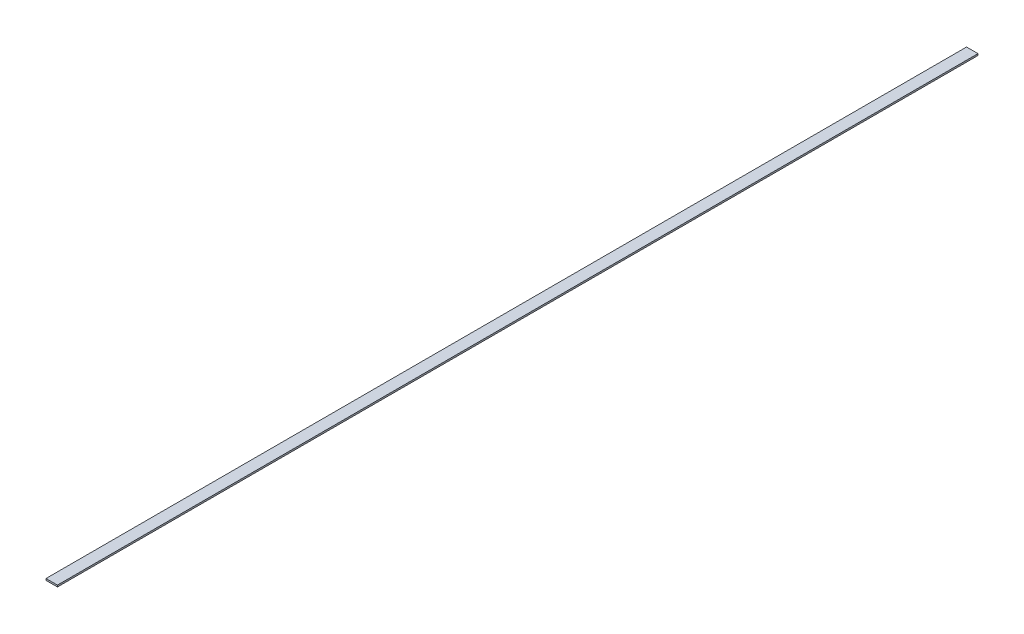
ISO-10303-21;
HEADER;
FILE_DESCRIPTION(('STEP AP214'),'2;1');
FILE_NAME('part.step','',(''),(''),'','','');
FILE_SCHEMA(('AUTOMOTIVE_DESIGN { 1 0 10303 214 1 1 1 1 }'));
ENDSEC;
DATA;
#1=APPLICATION_CONTEXT('core data for automotive mechanical design processes');
#2=APPLICATION_PROTOCOL_DEFINITION('international standard','automotive_design',2000,#1);
#3=PRODUCT_CONTEXT('',#1,'mechanical');
#4=PRODUCT('Part','Part','',(#3));
#5=PRODUCT_RELATED_PRODUCT_CATEGORY('part','',(#4));
#6=PRODUCT_DEFINITION_FORMATION('','',#4);
#7=PRODUCT_DEFINITION_CONTEXT('part definition',#1,'design');
#8=PRODUCT_DEFINITION('design','',#6,#7);
#9=PRODUCT_DEFINITION_SHAPE('','',#8);
#10=(LENGTH_UNIT() NAMED_UNIT(*) SI_UNIT(.MILLI.,.METRE.));
#11=(NAMED_UNIT(*) PLANE_ANGLE_UNIT() SI_UNIT($,.RADIAN.));
#12=(NAMED_UNIT(*) SI_UNIT($,.STERADIAN.) SOLID_ANGLE_UNIT());
#13=UNCERTAINTY_MEASURE_WITH_UNIT(LENGTH_MEASURE(1.E-05),#10,'distance_accuracy_value','');
#14=(GEOMETRIC_REPRESENTATION_CONTEXT(3) GLOBAL_UNCERTAINTY_ASSIGNED_CONTEXT((#13)) GLOBAL_UNIT_ASSIGNED_CONTEXT((#10,
#11,#12)) REPRESENTATION_CONTEXT('',''));
#15=CARTESIAN_POINT('',(0.,0.,0.));
#16=DIRECTION('',(0.,0.,1.));
#17=DIRECTION('',(1.,0.,0.));
#18=AXIS2_PLACEMENT_3D('',#15,#16,#17);
#19=CARTESIAN_POINT('',(-4.1,-0.600000000000001,660.));
#20=DIRECTION('',(1.,0.,0.));
#21=DIRECTION('',(0.,0.,-1.));
#22=AXIS2_PLACEMENT_3D('',#19,#20,#21);
#23=PLANE('',#22);
#24=DIRECTION('',(0.,-1.,0.));
#25=VECTOR('',#24,1.);
#26=CARTESIAN_POINT('',(-4.1,-0.600000000000001,0.));
#27=LINE('',#26,#25);
#28=CARTESIAN_POINT('',(-4.1,0.599999999999999,0.));
#29=VERTEX_POINT('',#28);
#30=CARTESIAN_POINT('',(-4.1,-0.600000000000001,0.));
#31=VERTEX_POINT('',#30);
#32=EDGE_CURVE('E95',#29,#31,#27,.T.);
#33=ORIENTED_EDGE('',*,*,#32,.T.);
#34=DIRECTION('',(0.,0.,-1.));
#35=VECTOR('',#34,1.);
#36=CARTESIAN_POINT('',(-4.1,-0.600000000000001,660.));
#37=LINE('',#36,#35);
#38=CARTESIAN_POINT('',(-4.1,-0.600000000000001,660.));
#39=VERTEX_POINT('',#38);
#40=EDGE_CURVE('E11',#39,#31,#37,.T.);
#41=ORIENTED_EDGE('',*,*,#40,.F.);
#42=DIRECTION('',(0.,-1.,0.));
#43=VECTOR('',#42,1.);
#44=CARTESIAN_POINT('',(-4.1,-0.600000000000001,660.));
#45=LINE('',#44,#43);
#46=CARTESIAN_POINT('',(-4.1,0.599999999999999,660.));
#47=VERTEX_POINT('',#46);
#48=EDGE_CURVE('E83',#47,#39,#45,.T.);
#49=ORIENTED_EDGE('',*,*,#48,.F.);
#50=DIRECTION('',(0.,0.,-1.));
#51=VECTOR('',#50,1.);
#52=CARTESIAN_POINT('',(-4.1,0.599999999999999,660.));
#53=LINE('',#52,#51);
#54=EDGE_CURVE('E91',#47,#29,#53,.T.);
#55=ORIENTED_EDGE('',*,*,#54,.T.);
#56=EDGE_LOOP('',(#33,#41,#49,#55));
#57=FACE_BOUND('',#56,.T.);
#58=ADVANCED_FACE('F32',(#57),#23,.F.);
#59=CARTESIAN_POINT('',(4.1,-0.599999999999999,660.));
#60=DIRECTION('',(0.,1.,0.));
#61=DIRECTION('',(-1.,0.,0.));
#62=AXIS2_PLACEMENT_3D('',#59,#60,#61);
#63=PLANE('',#62);
#64=DIRECTION('',(1.,0.,0.));
#65=VECTOR('',#64,1.);
#66=CARTESIAN_POINT('',(4.1,-0.599999999999999,0.));
#67=LINE('',#66,#65);
#68=CARTESIAN_POINT('',(4.1,-0.599999999999999,0.));
#69=VERTEX_POINT('',#68);
#70=EDGE_CURVE('E87',#31,#69,#67,.T.);
#71=ORIENTED_EDGE('',*,*,#70,.T.);
#72=DIRECTION('',(0.,0.,-1.));
#73=VECTOR('',#72,1.);
#74=CARTESIAN_POINT('',(4.1,-0.599999999999999,660.));
#75=LINE('',#74,#73);
#76=CARTESIAN_POINT('',(4.1,-0.599999999999999,660.));
#77=VERTEX_POINT('',#76);
#78=EDGE_CURVE('E40',#77,#69,#75,.T.);
#79=ORIENTED_EDGE('',*,*,#78,.F.);
#80=DIRECTION('',(1.,0.,0.));
#81=VECTOR('',#80,1.);
#82=CARTESIAN_POINT('',(4.1,-0.599999999999999,660.));
#83=LINE('',#82,#81);
#84=EDGE_CURVE('E78',#39,#77,#83,.T.);
#85=ORIENTED_EDGE('',*,*,#84,.F.);
#86=ORIENTED_EDGE('',*,*,#40,.T.);
#87=EDGE_LOOP('',(#71,#79,#85,#86));
#88=FACE_BOUND('',#87,.T.);
#89=ADVANCED_FACE('F86',(#88),#63,.F.);
#90=CARTESIAN_POINT('',(4.1,-0.599999999999999,660.));
#91=DIRECTION('',(-1.,0.,0.));
#92=DIRECTION('',(0.,0.,1.));
#93=AXIS2_PLACEMENT_3D('',#90,#91,#92);
#94=PLANE('',#93);
#95=DIRECTION('',(0.,1.,0.));
#96=VECTOR('',#95,1.);
#97=CARTESIAN_POINT('',(4.1,-0.599999999999999,0.));
#98=LINE('',#97,#96);
#99=CARTESIAN_POINT('',(4.1,0.6,0.));
#100=VERTEX_POINT('',#99);
#101=EDGE_CURVE('E65',#69,#100,#98,.T.);
#102=ORIENTED_EDGE('',*,*,#101,.T.);
#103=DIRECTION('',(0.,0.,-1.));
#104=VECTOR('',#103,1.);
#105=CARTESIAN_POINT('',(4.1,0.6,660.));
#106=LINE('',#105,#104);
#107=CARTESIAN_POINT('',(4.1,0.6,660.));
#108=VERTEX_POINT('',#107);
#109=EDGE_CURVE('E88',#108,#100,#106,.T.);
#110=ORIENTED_EDGE('',*,*,#109,.F.);
#111=DIRECTION('',(0.,1.,0.));
#112=VECTOR('',#111,1.);
#113=CARTESIAN_POINT('',(4.1,-0.599999999999999,660.));
#114=LINE('',#113,#112);
#115=EDGE_CURVE('E81',#77,#108,#114,.T.);
#116=ORIENTED_EDGE('',*,*,#115,.F.);
#117=ORIENTED_EDGE('',*,*,#78,.T.);
#118=EDGE_LOOP('',(#102,#110,#116,#117));
#119=FACE_BOUND('',#118,.T.);
#120=ADVANCED_FACE('F89',(#119),#94,.F.);
#121=CARTESIAN_POINT('',(4.1,0.6,660.));
#122=DIRECTION('',(0.,-1.,0.));
#123=DIRECTION('',(1.,0.,0.));
#124=AXIS2_PLACEMENT_3D('',#121,#122,#123);
#125=PLANE('',#124);
#126=DIRECTION('',(-1.,0.,0.));
#127=VECTOR('',#126,1.);
#128=CARTESIAN_POINT('',(4.1,0.6,0.));
#129=LINE('',#128,#127);
#130=EDGE_CURVE('E71',#100,#29,#129,.T.);
#131=ORIENTED_EDGE('',*,*,#130,.T.);
#132=ORIENTED_EDGE('',*,*,#54,.F.);
#133=DIRECTION('',(-1.,0.,0.));
#134=VECTOR('',#133,1.);
#135=CARTESIAN_POINT('',(4.1,0.6,660.));
#136=LINE('',#135,#134);
#137=EDGE_CURVE('E48',#108,#47,#136,.T.);
#138=ORIENTED_EDGE('',*,*,#137,.F.);
#139=ORIENTED_EDGE('',*,*,#109,.T.);
#140=EDGE_LOOP('',(#131,#132,#138,#139));
#141=FACE_BOUND('',#140,.T.);
#142=ADVANCED_FACE('F102',(#141),#125,.F.);
#143=CARTESIAN_POINT('',(0.,0.,660.));
#144=DIRECTION('',(0.,0.,1.));
#145=DIRECTION('',(1.,0.,0.));
#146=AXIS2_PLACEMENT_3D('',#143,#144,#145);
#147=PLANE('',#146);
#148=ORIENTED_EDGE('',*,*,#48,.T.);
#149=ORIENTED_EDGE('',*,*,#84,.T.);
#150=ORIENTED_EDGE('',*,*,#115,.T.);
#151=ORIENTED_EDGE('',*,*,#137,.T.);
#152=EDGE_LOOP('',(#148,#149,#150,#151));
#153=FACE_BOUND('',#152,.T.);
#154=ADVANCED_FACE('F79',(#153),#147,.T.);
#155=CARTESIAN_POINT('',(0.,0.,0.));
#156=DIRECTION('',(0.,0.,1.));
#157=DIRECTION('',(1.,0.,0.));
#158=AXIS2_PLACEMENT_3D('',#155,#156,#157);
#159=PLANE('',#158);
#160=ORIENTED_EDGE('',*,*,#32,.F.);
#161=ORIENTED_EDGE('',*,*,#130,.F.);
#162=ORIENTED_EDGE('',*,*,#101,.F.);
#163=ORIENTED_EDGE('',*,*,#70,.F.);
#164=EDGE_LOOP('',(#160,#161,#162,#163));
#165=FACE_BOUND('',#164,.T.);
#166=ADVANCED_FACE('F105',(#165),#159,.F.);
#167=CLOSED_SHELL('',(#58,#89,#120,#142,#154,#166));
#168=MANIFOLD_SOLID_BREP('B2',#167);
#169=ADVANCED_BREP_SHAPE_REPRESENTATION('',(#18,#168),#14);
#170=SHAPE_DEFINITION_REPRESENTATION(#9,#169);
ENDSEC;
END-ISO-10303-21;
